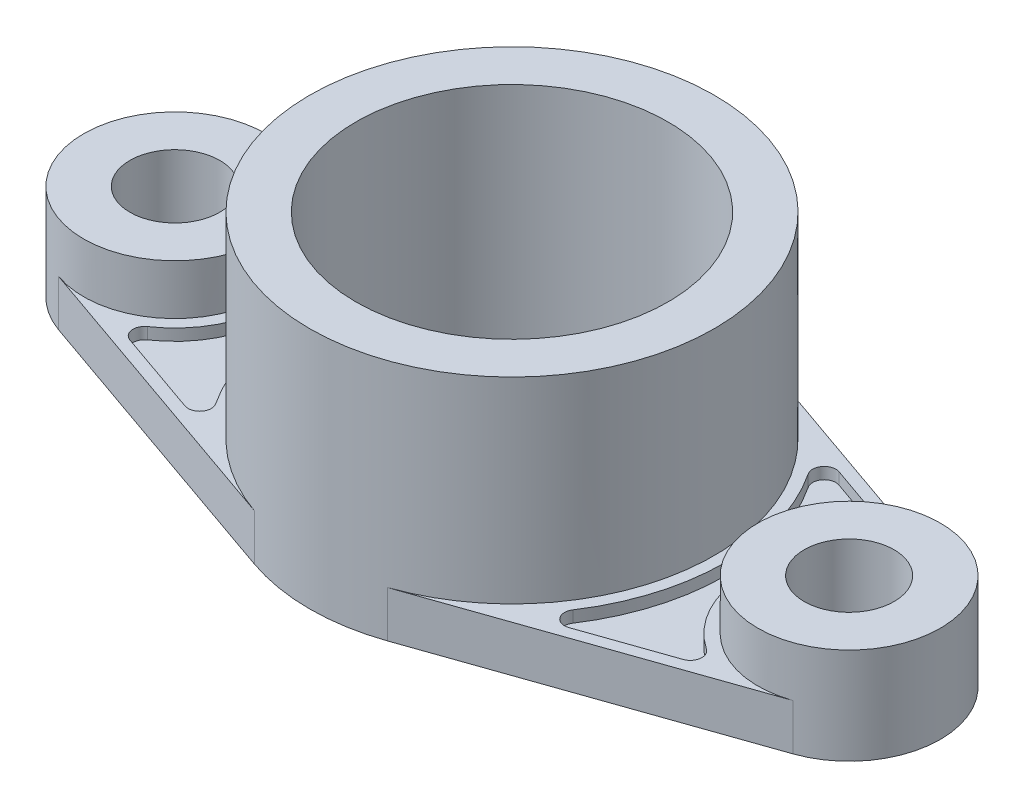
ISO-10303-21;
HEADER;
FILE_DESCRIPTION(('STEP AP214'),'2;1');
FILE_NAME('part.step','',(''),(''),'','','');
FILE_SCHEMA(('AUTOMOTIVE_DESIGN { 1 0 10303 214 1 1 1 1 }'));
ENDSEC;
DATA;
#1=APPLICATION_CONTEXT('core data for automotive mechanical design processes');
#2=APPLICATION_PROTOCOL_DEFINITION('international standard','automotive_design',2000,#1);
#3=PRODUCT_CONTEXT('',#1,'mechanical');
#4=PRODUCT('Part','Part','',(#3));
#5=PRODUCT_RELATED_PRODUCT_CATEGORY('part','',(#4));
#6=PRODUCT_DEFINITION_FORMATION('','',#4);
#7=PRODUCT_DEFINITION_CONTEXT('part definition',#1,'design');
#8=PRODUCT_DEFINITION('design','',#6,#7);
#9=PRODUCT_DEFINITION_SHAPE('','',#8);
#10=(LENGTH_UNIT() NAMED_UNIT(*) SI_UNIT(.MILLI.,.METRE.));
#11=(NAMED_UNIT(*) PLANE_ANGLE_UNIT() SI_UNIT($,.RADIAN.));
#12=(NAMED_UNIT(*) SI_UNIT($,.STERADIAN.) SOLID_ANGLE_UNIT());
#13=UNCERTAINTY_MEASURE_WITH_UNIT(LENGTH_MEASURE(1.E-05),#10,'distance_accuracy_value','');
#14=(GEOMETRIC_REPRESENTATION_CONTEXT(3) GLOBAL_UNCERTAINTY_ASSIGNED_CONTEXT((#13)) GLOBAL_UNIT_ASSIGNED_CONTEXT((#10,
#11,#12)) REPRESENTATION_CONTEXT('',''));
#15=CARTESIAN_POINT('',(0.,0.,0.));
#16=DIRECTION('',(0.,0.,1.));
#17=DIRECTION('',(1.,0.,0.));
#18=AXIS2_PLACEMENT_3D('',#15,#16,#17);
#19=CARTESIAN_POINT('',(0.,63.,0.));
#20=DIRECTION('',(0.,-1.,0.));
#21=DIRECTION('',(0.,0.,-1.));
#22=AXIS2_PLACEMENT_3D('',#19,#20,#21);
#23=CYLINDRICAL_SURFACE('',#22,52.5);
#24=CARTESIAN_POINT('',(0.,63.,0.));
#25=DIRECTION('',(0.,1.,0.));
#26=DIRECTION('',(0.,0.,1.));
#27=AXIS2_PLACEMENT_3D('',#24,#25,#26);
#28=CIRCLE('',#27,52.5);
#29=CARTESIAN_POINT('',(0.,63.,52.5));
#30=VERTEX_POINT('',#29);
#31=EDGE_CURVE('E11',#30,#30,#28,.T.);
#32=ORIENTED_EDGE('',*,*,#31,.F.);
#33=EDGE_LOOP('',(#32));
#34=FACE_BOUND('',#33,.T.);
#35=DIRECTION('',(0.,-1.,0.));
#36=VECTOR('',#35,1.);
#37=CARTESIAN_POINT('',(17.301,12.,49.56738241021));
#38=LINE('',#37,#36);
#39=CARTESIAN_POINT('',(17.301,12.,49.56738241021));
#40=VERTEX_POINT('',#39);
#41=CARTESIAN_POINT('',(17.301,0.,49.56738241021));
#42=VERTEX_POINT('',#41);
#43=EDGE_CURVE('E430',#40,#42,#38,.T.);
#44=ORIENTED_EDGE('',*,*,#43,.F.);
#45=CARTESIAN_POINT('',(0.,12.,0.));
#46=DIRECTION('',(0.,1.,0.));
#47=DIRECTION('',(0.,0.,1.));
#48=AXIS2_PLACEMENT_3D('',#45,#46,#47);
#49=CIRCLE('',#48,52.5);
#50=CARTESIAN_POINT('',(17.301,12.,-49.56738241021));
#51=VERTEX_POINT('',#50);
#52=EDGE_CURVE('E398',#40,#51,#49,.T.);
#53=ORIENTED_EDGE('',*,*,#52,.T.);
#54=DIRECTION('',(0.,-1.,0.));
#55=VECTOR('',#54,1.);
#56=CARTESIAN_POINT('',(17.301,12.,-49.56738241021));
#57=LINE('',#56,#55);
#58=CARTESIAN_POINT('',(17.301,0.,-49.56738241021));
#59=VERTEX_POINT('',#58);
#60=EDGE_CURVE('E414',#51,#59,#57,.T.);
#61=ORIENTED_EDGE('',*,*,#60,.T.);
#62=CARTESIAN_POINT('',(0.,0.,0.));
#63=DIRECTION('',(0.,1.,0.));
#64=DIRECTION('',(0.,0.,1.));
#65=AXIS2_PLACEMENT_3D('',#62,#63,#64);
#66=CIRCLE('',#65,52.5);
#67=CARTESIAN_POINT('',(-17.301,0.,-49.56738241021));
#68=VERTEX_POINT('',#67);
#69=EDGE_CURVE('E492',#59,#68,#66,.T.);
#70=ORIENTED_EDGE('',*,*,#69,.T.);
#71=DIRECTION('',(0.,-1.,0.));
#72=VECTOR('',#71,1.);
#73=CARTESIAN_POINT('',(-17.301,12.,-49.56738241021));
#74=LINE('',#73,#72);
#75=CARTESIAN_POINT('',(-17.301,12.,-49.56738241021));
#76=VERTEX_POINT('',#75);
#77=EDGE_CURVE('E483',#76,#68,#74,.T.);
#78=ORIENTED_EDGE('',*,*,#77,.F.);
#79=CARTESIAN_POINT('',(0.,12.,0.));
#80=DIRECTION('',(0.,1.,0.));
#81=DIRECTION('',(0.,0.,1.));
#82=AXIS2_PLACEMENT_3D('',#79,#80,#81);
#83=CIRCLE('',#82,52.5);
#84=CARTESIAN_POINT('',(-17.301,12.,49.56738241021));
#85=VERTEX_POINT('',#84);
#86=EDGE_CURVE('E451',#76,#85,#83,.T.);
#87=ORIENTED_EDGE('',*,*,#86,.T.);
#88=DIRECTION('',(0.,-1.,0.));
#89=VECTOR('',#88,1.);
#90=CARTESIAN_POINT('',(-17.301,12.,49.56738241021));
#91=LINE('',#90,#89);
#92=CARTESIAN_POINT('',(-17.301,0.,49.56738241021));
#93=VERTEX_POINT('',#92);
#94=EDGE_CURVE('E467',#85,#93,#91,.T.);
#95=ORIENTED_EDGE('',*,*,#94,.T.);
#96=EDGE_CURVE('E48',#93,#42,#66,.T.);
#97=ORIENTED_EDGE('',*,*,#96,.T.);
#98=EDGE_LOOP('',(#44,#53,#61,#70,#78,#87,#95,#97));
#99=FACE_BOUND('',#98,.T.);
#100=ADVANCED_FACE('F45',(#34,#99),#23,.T.);
#101=CARTESIAN_POINT('',(0.,63.,0.));
#102=DIRECTION('',(0.,1.,0.));
#103=DIRECTION('',(0.,0.,1.));
#104=AXIS2_PLACEMENT_3D('',#101,#102,#103);
#105=PLANE('',#104);
#106=ORIENTED_EDGE('',*,*,#31,.T.);
#107=EDGE_LOOP('',(#106));
#108=FACE_BOUND('',#107,.T.);
#109=CARTESIAN_POINT('',(0.,63.,0.));
#110=DIRECTION('',(0.,1.,0.));
#111=DIRECTION('',(0.,0.,1.));
#112=AXIS2_PLACEMENT_3D('',#109,#110,#111);
#113=CIRCLE('',#112,40.5);
#114=CARTESIAN_POINT('',(0.,63.,40.5));
#115=VERTEX_POINT('',#114);
#116=EDGE_CURVE('E488',#115,#115,#113,.T.);
#117=ORIENTED_EDGE('',*,*,#116,.F.);
#118=EDGE_LOOP('',(#117));
#119=FACE_BOUND('',#118,.T.);
#120=ADVANCED_FACE('F512',(#108,#119),#105,.T.);
#121=CARTESIAN_POINT('',(0.,0.,0.));
#122=DIRECTION('',(0.,1.,0.));
#123=DIRECTION('',(0.,0.,1.));
#124=AXIS2_PLACEMENT_3D('',#121,#122,#123);
#125=PLANE('',#124);
#126=ORIENTED_EDGE('',*,*,#96,.F.);
#127=DIRECTION('',(0.944140617337334,0.,0.329542857142857));
#128=VECTOR('',#127,1.);
#129=CARTESIAN_POINT('',(-17.301,0.,49.56738241021));
#130=LINE('',#129,#128);
#131=CARTESIAN_POINT('',(-95.2986317142857,0.,22.343087709288));
#132=VERTEX_POINT('',#131);
#133=EDGE_CURVE('E455',#132,#93,#130,.T.);
#134=ORIENTED_EDGE('',*,*,#133,.F.);
#135=CARTESIAN_POINT('',(-87.5,0.,0.));
#136=DIRECTION('',(0.,1.,0.));
#137=DIRECTION('',(0.,0.,1.));
#138=AXIS2_PLACEMENT_3D('',#135,#136,#137);
#139=CIRCLE('',#138,23.665);
#140=CARTESIAN_POINT('',(-95.2986317142857,0.,-22.343087709288));
#141=VERTEX_POINT('',#140);
#142=EDGE_CURVE('E439',#141,#132,#139,.T.);
#143=ORIENTED_EDGE('',*,*,#142,.F.);
#144=DIRECTION('',(-0.944140617337334,0.,0.329542857142857));
#145=VECTOR('',#144,1.);
#146=CARTESIAN_POINT('',(-17.301,0.,-49.56738241021));
#147=LINE('',#146,#145);
#148=EDGE_CURVE('E447',#68,#141,#147,.T.);
#149=ORIENTED_EDGE('',*,*,#148,.F.);
#150=ORIENTED_EDGE('',*,*,#69,.F.);
#151=DIRECTION('',(0.944140617337334,0.,0.329542857142857));
#152=VECTOR('',#151,1.);
#153=CARTESIAN_POINT('',(17.301,0.,-49.56738241021));
#154=LINE('',#153,#152);
#155=CARTESIAN_POINT('',(95.2986317142857,0.,-22.343087709288));
#156=VERTEX_POINT('',#155);
#157=EDGE_CURVE('E402',#59,#156,#154,.T.);
#158=ORIENTED_EDGE('',*,*,#157,.T.);
#159=CARTESIAN_POINT('',(87.5,0.,0.));
#160=DIRECTION('',(0.,1.,0.));
#161=DIRECTION('',(0.,0.,1.));
#162=AXIS2_PLACEMENT_3D('',#159,#160,#161);
#163=CIRCLE('',#162,23.665);
#164=CARTESIAN_POINT('',(95.2986317142857,0.,22.343087709288));
#165=VERTEX_POINT('',#164);
#166=EDGE_CURVE('E382',#165,#156,#163,.T.);
#167=ORIENTED_EDGE('',*,*,#166,.F.);
#168=DIRECTION('',(0.944140617337334,0.,-0.329542857142857));
#169=VECTOR('',#168,1.);
#170=CARTESIAN_POINT('',(17.301,0.,49.56738241021));
#171=LINE('',#170,#169);
#172=EDGE_CURVE('E394',#42,#165,#171,.T.);
#173=ORIENTED_EDGE('',*,*,#172,.F.);
#174=EDGE_LOOP('',(#126,#134,#143,#149,#150,#158,#167,#173));
#175=FACE_BOUND('',#174,.T.);
#176=CARTESIAN_POINT('',(0.,0.,0.));
#177=DIRECTION('',(0.,1.,0.));
#178=DIRECTION('',(0.,0.,1.));
#179=AXIS2_PLACEMENT_3D('',#176,#177,#178);
#180=CIRCLE('',#179,40.5);
#181=CARTESIAN_POINT('',(0.,0.,40.5));
#182=VERTEX_POINT('',#181);
#183=EDGE_CURVE('E487',#182,#182,#180,.T.);
#184=ORIENTED_EDGE('',*,*,#183,.T.);
#185=EDGE_LOOP('',(#184));
#186=FACE_BOUND('',#185,.T.);
#187=CARTESIAN_POINT('',(-87.5,0.,0.));
#188=DIRECTION('',(0.,1.,0.));
#189=DIRECTION('',(0.,0.,1.));
#190=AXIS2_PLACEMENT_3D('',#187,#188,#189);
#191=CIRCLE('',#190,11.665);
#192=CARTESIAN_POINT('',(-87.5,0.,11.665));
#193=VERTEX_POINT('',#192);
#194=EDGE_CURVE('E434',#193,#193,#191,.T.);
#195=ORIENTED_EDGE('',*,*,#194,.T.);
#196=EDGE_LOOP('',(#195));
#197=FACE_BOUND('',#196,.T.);
#198=CARTESIAN_POINT('',(87.5,0.,0.));
#199=DIRECTION('',(0.,1.,0.));
#200=DIRECTION('',(0.,0.,1.));
#201=AXIS2_PLACEMENT_3D('',#198,#199,#200);
#202=CIRCLE('',#201,11.665);
#203=CARTESIAN_POINT('',(87.5,0.,11.665));
#204=VERTEX_POINT('',#203);
#205=EDGE_CURVE('E390',#204,#204,#202,.T.);
#206=ORIENTED_EDGE('',*,*,#205,.T.);
#207=EDGE_LOOP('',(#206));
#208=FACE_BOUND('',#207,.T.);
#209=ADVANCED_FACE('F497',(#175,#186,#197,#208),#125,.F.);
#210=CARTESIAN_POINT('',(0.,63.,0.));
#211=DIRECTION('',(0.,-1.,0.));
#212=DIRECTION('',(0.,0.,-1.));
#213=AXIS2_PLACEMENT_3D('',#210,#211,#212);
#214=CYLINDRICAL_SURFACE('',#213,40.5);
#215=ORIENTED_EDGE('',*,*,#116,.T.);
#216=EDGE_LOOP('',(#215));
#217=FACE_BOUND('',#216,.T.);
#218=ORIENTED_EDGE('',*,*,#183,.F.);
#219=EDGE_LOOP('',(#218));
#220=FACE_BOUND('',#219,.T.);
#221=ADVANCED_FACE('F500',(#217,#220),#214,.F.);
#222=CARTESIAN_POINT('',(-17.301,12.,-49.56738241021));
#223=DIRECTION('',(0.329542857142857,0.,0.944140617337334));
#224=DIRECTION('',(0.944140617337334,0.,-0.329542857142857));
#225=AXIS2_PLACEMENT_3D('',#222,#223,#224);
#226=PLANE('',#225);
#227=ORIENTED_EDGE('',*,*,#148,.T.);
#228=DIRECTION('',(0.,-1.,0.));
#229=VECTOR('',#228,1.);
#230=CARTESIAN_POINT('',(-95.2986317142857,12.,-22.343087709288));
#231=LINE('',#230,#229);
#232=CARTESIAN_POINT('',(-95.2986317142857,12.,-22.343087709288));
#233=VERTEX_POINT('',#232);
#234=EDGE_CURVE('E479',#233,#141,#231,.T.);
#235=ORIENTED_EDGE('',*,*,#234,.F.);
#236=DIRECTION('',(-0.944140617337334,0.,0.329542857142857));
#237=VECTOR('',#236,1.);
#238=CARTESIAN_POINT('',(-17.301,12.,-49.56738241021));
#239=LINE('',#238,#237);
#240=EDGE_CURVE('E454',#76,#233,#239,.T.);
#241=ORIENTED_EDGE('',*,*,#240,.F.);
#242=ORIENTED_EDGE('',*,*,#77,.T.);
#243=EDGE_LOOP('',(#227,#235,#241,#242));
#244=FACE_BOUND('',#243,.T.);
#245=ADVANCED_FACE('F502',(#244),#226,.F.);
#246=CARTESIAN_POINT('',(-17.301,12.,49.56738241021));
#247=DIRECTION('',(0.329542857142857,0.,-0.944140617337334));
#248=DIRECTION('',(-0.944140617337334,0.,-0.329542857142857));
#249=AXIS2_PLACEMENT_3D('',#246,#247,#248);
#250=PLANE('',#249);
#251=ORIENTED_EDGE('',*,*,#133,.T.);
#252=ORIENTED_EDGE('',*,*,#94,.F.);
#253=DIRECTION('',(0.944140617337334,0.,0.329542857142857));
#254=VECTOR('',#253,1.);
#255=CARTESIAN_POINT('',(-17.301,12.,49.56738241021));
#256=LINE('',#255,#254);
#257=CARTESIAN_POINT('',(-95.2986317142857,12.,22.343087709288));
#258=VERTEX_POINT('',#257);
#259=EDGE_CURVE('E463',#258,#85,#256,.T.);
#260=ORIENTED_EDGE('',*,*,#259,.F.);
#261=DIRECTION('',(0.,-1.,0.));
#262=VECTOR('',#261,1.);
#263=CARTESIAN_POINT('',(-95.2986317142857,12.,22.343087709288));
#264=LINE('',#263,#262);
#265=EDGE_CURVE('E476',#258,#132,#264,.T.);
#266=ORIENTED_EDGE('',*,*,#265,.T.);
#267=EDGE_LOOP('',(#251,#252,#260,#266));
#268=FACE_BOUND('',#267,.T.);
#269=ADVANCED_FACE('F509',(#268),#250,.F.);
#270=CARTESIAN_POINT('',(0.,12.,0.));
#271=DIRECTION('',(0.,1.,0.));
#272=DIRECTION('',(0.,0.,1.));
#273=AXIS2_PLACEMENT_3D('',#270,#271,#272);
#274=PLANE('',#273);
#275=CARTESIAN_POINT('',(-48.8374101689385,12.,-32.2049276973396));
#276=DIRECTION('',(0.,1.,0.));
#277=DIRECTION('',(0.,0.,1.));
#278=AXIS2_PLACEMENT_3D('',#275,#276,#277);
#279=CIRCLE('',#278,3.00000000000001);
#280=CARTESIAN_POINT('',(-46.3329275961723,12.,-30.5533929436299));
#281=VERTEX_POINT('',#280);
#282=CARTESIAN_POINT('',(-49.826038740367,12.,-35.0373495493516));
#283=VERTEX_POINT('',#282);
#284=EDGE_CURVE('E60',#281,#283,#279,.T.);
#285=ORIENTED_EDGE('',*,*,#284,.F.);
#286=CARTESIAN_POINT('',(0.,12.,0.));
#287=DIRECTION('',(0.,1.,0.));
#288=DIRECTION('',(0.,0.,1.));
#289=AXIS2_PLACEMENT_3D('',#286,#287,#288);
#290=CIRCLE('',#289,55.5);
#291=CARTESIAN_POINT('',(-46.3329275961724,12.,30.5533929436298));
#292=VERTEX_POINT('',#291);
#293=EDGE_CURVE('E230',#281,#292,#290,.T.);
#294=ORIENTED_EDGE('',*,*,#293,.T.);
#295=CARTESIAN_POINT('',(-48.8374101689384,12.,32.2049276973396));
#296=DIRECTION('',(0.,1.,0.));
#297=DIRECTION('',(0.,0.,1.));
#298=AXIS2_PLACEMENT_3D('',#295,#296,#297);
#299=CIRCLE('',#298,3.);
#300=CARTESIAN_POINT('',(-49.826038740367,12.,35.0373495493516));
#301=VERTEX_POINT('',#300);
#302=EDGE_CURVE('E234',#301,#292,#299,.T.);
#303=ORIENTED_EDGE('',*,*,#302,.F.);
#304=DIRECTION('',(0.944140617337334,0.,0.329542857142857));
#305=VECTOR('',#304,1.);
#306=CARTESIAN_POINT('',(-71.8093276206941,12.,27.3643020244494));
#307=LINE('',#306,#305);
#308=CARTESIAN_POINT('',(-71.8093276206941,12.,27.3643020244494));
#309=VERTEX_POINT('',#308);
#310=EDGE_CURVE('E272',#309,#301,#307,.T.);
#311=ORIENTED_EDGE('',*,*,#310,.F.);
#312=CARTESIAN_POINT('',(-70.8206990492656,12.,24.5318801724374));
#313=DIRECTION('',(0.,1.,0.));
#314=DIRECTION('',(0.,0.,1.));
#315=AXIS2_PLACEMENT_3D('',#312,#313,#314);
#316=CIRCLE('',#315,3.);
#317=CARTESIAN_POINT('',(-72.507464694039,12.,22.0509888689716));
#318=VERTEX_POINT('',#317);
#319=EDGE_CURVE('E268',#318,#309,#316,.T.);
#320=ORIENTED_EDGE('',*,*,#319,.F.);
#321=CARTESIAN_POINT('',(-87.5,12.,0.));
#322=DIRECTION('',(0.,1.,0.));
#323=DIRECTION('',(0.,0.,1.));
#324=AXIS2_PLACEMENT_3D('',#321,#322,#323);
#325=CIRCLE('',#324,26.665);
#326=CARTESIAN_POINT('',(-72.507464694039,12.,-22.0509888689717));
#327=VERTEX_POINT('',#326);
#328=EDGE_CURVE('E264',#318,#327,#325,.T.);
#329=ORIENTED_EDGE('',*,*,#328,.T.);
#330=CARTESIAN_POINT('',(-70.8206990492656,12.,-24.5318801724374));
#331=DIRECTION('',(0.,-1.,0.));
#332=DIRECTION('',(0.,0.,-1.));
#333=AXIS2_PLACEMENT_3D('',#330,#331,#332);
#334=CIRCLE('',#333,3.);
#335=CARTESIAN_POINT('',(-71.8093276206941,12.,-27.3643020244494));
#336=VERTEX_POINT('',#335);
#337=EDGE_CURVE('E260',#327,#336,#334,.T.);
#338=ORIENTED_EDGE('',*,*,#337,.T.);
#339=DIRECTION('',(-0.944140617337334,0.,0.329542857142858));
#340=VECTOR('',#339,1.);
#341=CARTESIAN_POINT('',(-49.826038740367,12.,-35.0373495493516));
#342=LINE('',#341,#340);
#343=EDGE_CURVE('E257',#283,#336,#342,.T.);
#344=ORIENTED_EDGE('',*,*,#343,.F.);
#345=EDGE_LOOP('',(#285,#294,#303,#311,#320,#329,#338,#344));
#346=FACE_BOUND('',#345,.T.);
#347=ORIENTED_EDGE('',*,*,#86,.F.);
#348=ORIENTED_EDGE('',*,*,#240,.T.);
#349=CARTESIAN_POINT('',(-87.5,12.,0.));
#350=DIRECTION('',(0.,1.,0.));
#351=DIRECTION('',(0.,0.,1.));
#352=AXIS2_PLACEMENT_3D('',#349,#350,#351);
#353=CIRCLE('',#352,23.665);
#354=EDGE_CURVE('E459',#258,#233,#353,.T.);
#355=ORIENTED_EDGE('',*,*,#354,.F.);
#356=ORIENTED_EDGE('',*,*,#259,.T.);
#357=EDGE_LOOP('',(#347,#348,#355,#356));
#358=FACE_BOUND('',#357,.T.);
#359=ADVANCED_FACE('F548',(#346,#358),#274,.T.);
#360=CARTESIAN_POINT('',(-87.5,25.,0.));
#361=DIRECTION('',(0.,1.,0.));
#362=DIRECTION('',(0.,0.,1.));
#363=AXIS2_PLACEMENT_3D('',#360,#361,#362);
#364=PLANE('',#363);
#365=CARTESIAN_POINT('',(-87.5,25.,0.));
#366=DIRECTION('',(0.,1.,0.));
#367=DIRECTION('',(0.,0.,1.));
#368=AXIS2_PLACEMENT_3D('',#365,#366,#367);
#369=CIRCLE('',#368,23.665);
#370=CARTESIAN_POINT('',(-87.5,25.,23.665));
#371=VERTEX_POINT('',#370);
#372=EDGE_CURVE('E443',#371,#371,#369,.T.);
#373=ORIENTED_EDGE('',*,*,#372,.T.);
#374=EDGE_LOOP('',(#373));
#375=FACE_BOUND('',#374,.T.);
#376=CARTESIAN_POINT('',(-87.5,25.,0.));
#377=DIRECTION('',(0.,1.,0.));
#378=DIRECTION('',(0.,0.,1.));
#379=AXIS2_PLACEMENT_3D('',#376,#377,#378);
#380=CIRCLE('',#379,11.665);
#381=CARTESIAN_POINT('',(-87.5,25.,11.665));
#382=VERTEX_POINT('',#381);
#383=EDGE_CURVE('E435',#382,#382,#380,.T.);
#384=ORIENTED_EDGE('',*,*,#383,.F.);
#385=EDGE_LOOP('',(#384));
#386=FACE_BOUND('',#385,.T.);
#387=ADVANCED_FACE('F558',(#375,#386),#364,.T.);
#388=CARTESIAN_POINT('',(-87.5,25.,0.));
#389=DIRECTION('',(0.,-1.,0.));
#390=DIRECTION('',(0.,0.,-1.));
#391=AXIS2_PLACEMENT_3D('',#388,#389,#390);
#392=CYLINDRICAL_SURFACE('',#391,23.665);
#393=ORIENTED_EDGE('',*,*,#234,.T.);
#394=ORIENTED_EDGE('',*,*,#142,.T.);
#395=ORIENTED_EDGE('',*,*,#265,.F.);
#396=ORIENTED_EDGE('',*,*,#354,.T.);
#397=EDGE_LOOP('',(#393,#394,#395,#396));
#398=FACE_BOUND('',#397,.T.);
#399=ORIENTED_EDGE('',*,*,#372,.F.);
#400=EDGE_LOOP('',(#399));
#401=FACE_BOUND('',#400,.T.);
#402=ADVANCED_FACE('F554',(#398,#401),#392,.T.);
#403=CARTESIAN_POINT('',(-87.5,25.,0.));
#404=DIRECTION('',(0.,-1.,0.));
#405=DIRECTION('',(0.,0.,-1.));
#406=AXIS2_PLACEMENT_3D('',#403,#404,#405);
#407=CYLINDRICAL_SURFACE('',#406,11.665);
#408=ORIENTED_EDGE('',*,*,#383,.T.);
#409=EDGE_LOOP('',(#408));
#410=FACE_BOUND('',#409,.T.);
#411=ORIENTED_EDGE('',*,*,#194,.F.);
#412=EDGE_LOOP('',(#411));
#413=FACE_BOUND('',#412,.T.);
#414=ADVANCED_FACE('F557',(#410,#413),#407,.F.);
#415=CARTESIAN_POINT('',(17.301,12.,49.56738241021));
#416=DIRECTION('',(-0.329542857142857,0.,-0.944140617337334));
#417=DIRECTION('',(-0.944140617337334,0.,0.329542857142857));
#418=AXIS2_PLACEMENT_3D('',#415,#416,#417);
#419=PLANE('',#418);
#420=ORIENTED_EDGE('',*,*,#172,.T.);
#421=DIRECTION('',(0.,-1.,0.));
#422=VECTOR('',#421,1.);
#423=CARTESIAN_POINT('',(95.2986317142857,12.,22.343087709288));
#424=LINE('',#423,#422);
#425=CARTESIAN_POINT('',(95.2986317142857,12.,22.343087709288));
#426=VERTEX_POINT('',#425);
#427=EDGE_CURVE('E426',#426,#165,#424,.T.);
#428=ORIENTED_EDGE('',*,*,#427,.F.);
#429=DIRECTION('',(0.944140617337334,0.,-0.329542857142857));
#430=VECTOR('',#429,1.);
#431=CARTESIAN_POINT('',(17.301,12.,49.56738241021));
#432=LINE('',#431,#430);
#433=EDGE_CURVE('E401',#40,#426,#432,.T.);
#434=ORIENTED_EDGE('',*,*,#433,.F.);
#435=ORIENTED_EDGE('',*,*,#43,.T.);
#436=EDGE_LOOP('',(#420,#428,#434,#435));
#437=FACE_BOUND('',#436,.T.);
#438=ADVANCED_FACE('F528',(#437),#419,.F.);
#439=CARTESIAN_POINT('',(17.301,12.,-49.56738241021));
#440=DIRECTION('',(0.329542857142857,0.,-0.944140617337334));
#441=DIRECTION('',(-0.944140617337334,0.,-0.329542857142857));
#442=AXIS2_PLACEMENT_3D('',#439,#440,#441);
#443=PLANE('',#442);
#444=ORIENTED_EDGE('',*,*,#157,.F.);
#445=ORIENTED_EDGE('',*,*,#60,.F.);
#446=DIRECTION('',(0.944140617337334,0.,0.329542857142857));
#447=VECTOR('',#446,1.);
#448=CARTESIAN_POINT('',(17.301,12.,-49.56738241021));
#449=LINE('',#448,#447);
#450=CARTESIAN_POINT('',(95.2986317142857,12.,-22.343087709288));
#451=VERTEX_POINT('',#450);
#452=EDGE_CURVE('E410',#51,#451,#449,.T.);
#453=ORIENTED_EDGE('',*,*,#452,.T.);
#454=DIRECTION('',(0.,-1.,0.));
#455=VECTOR('',#454,1.);
#456=CARTESIAN_POINT('',(95.2986317142857,12.,-22.343087709288));
#457=LINE('',#456,#455);
#458=EDGE_CURVE('E423',#451,#156,#457,.T.);
#459=ORIENTED_EDGE('',*,*,#458,.T.);
#460=EDGE_LOOP('',(#444,#445,#453,#459));
#461=FACE_BOUND('',#460,.T.);
#462=ADVANCED_FACE('F535',(#461),#443,.T.);
#463=CARTESIAN_POINT('',(0.,12.,0.));
#464=DIRECTION('',(0.,1.,0.));
#465=DIRECTION('',(0.,0.,1.));
#466=AXIS2_PLACEMENT_3D('',#463,#464,#465);
#467=PLANE('',#466);
#468=CARTESIAN_POINT('',(0.,12.,0.));
#469=DIRECTION('',(0.,-1.,0.));
#470=DIRECTION('',(0.,0.,-1.));
#471=AXIS2_PLACEMENT_3D('',#468,#469,#470);
#472=CIRCLE('',#471,55.5);
#473=CARTESIAN_POINT('',(46.3329275961724,12.,-30.5533929436299));
#474=VERTEX_POINT('',#473);
#475=CARTESIAN_POINT('',(46.3329275961724,12.,30.5533929436298));
#476=VERTEX_POINT('',#475);
#477=EDGE_CURVE('E325',#474,#476,#472,.T.);
#478=ORIENTED_EDGE('',*,*,#477,.F.);
#479=CARTESIAN_POINT('',(48.8374101689385,12.,-32.2049276973396));
#480=DIRECTION('',(0.,-1.,0.));
#481=DIRECTION('',(0.,0.,-1.));
#482=AXIS2_PLACEMENT_3D('',#479,#480,#481);
#483=CIRCLE('',#482,3.00000000000001);
#484=CARTESIAN_POINT('',(49.826038740367,12.,-35.0373495493516));
#485=VERTEX_POINT('',#484);
#486=EDGE_CURVE('E68',#474,#485,#483,.T.);
#487=ORIENTED_EDGE('',*,*,#486,.T.);
#488=DIRECTION('',(0.944140617337334,0.,0.329542857142858));
#489=VECTOR('',#488,1.);
#490=CARTESIAN_POINT('',(49.826038740367,12.,-35.0373495493516));
#491=LINE('',#490,#489);
#492=CARTESIAN_POINT('',(71.8093276206941,12.,-27.3643020244494));
#493=VERTEX_POINT('',#492);
#494=EDGE_CURVE('E350',#485,#493,#491,.T.);
#495=ORIENTED_EDGE('',*,*,#494,.T.);
#496=CARTESIAN_POINT('',(70.8206990492656,12.,-24.5318801724374));
#497=DIRECTION('',(0.,1.,0.));
#498=DIRECTION('',(0.,0.,1.));
#499=AXIS2_PLACEMENT_3D('',#496,#497,#498);
#500=CIRCLE('',#499,3.);
#501=CARTESIAN_POINT('',(72.507464694039,12.,-22.0509888689716));
#502=VERTEX_POINT('',#501);
#503=EDGE_CURVE('E346',#502,#493,#500,.T.);
#504=ORIENTED_EDGE('',*,*,#503,.F.);
#505=CARTESIAN_POINT('',(87.5,12.,0.));
#506=DIRECTION('',(0.,-1.,0.));
#507=DIRECTION('',(0.,0.,-1.));
#508=AXIS2_PLACEMENT_3D('',#505,#506,#507);
#509=CIRCLE('',#508,26.665);
#510=CARTESIAN_POINT('',(72.507464694039,12.,22.0509888689716));
#511=VERTEX_POINT('',#510);
#512=EDGE_CURVE('E342',#511,#502,#509,.T.);
#513=ORIENTED_EDGE('',*,*,#512,.F.);
#514=CARTESIAN_POINT('',(70.8206990492656,12.,24.5318801724374));
#515=DIRECTION('',(0.,-1.,0.));
#516=DIRECTION('',(0.,0.,-1.));
#517=AXIS2_PLACEMENT_3D('',#514,#515,#516);
#518=CIRCLE('',#517,3.);
#519=CARTESIAN_POINT('',(71.8093276206941,12.,27.3643020244494));
#520=VERTEX_POINT('',#519);
#521=EDGE_CURVE('E338',#511,#520,#518,.T.);
#522=ORIENTED_EDGE('',*,*,#521,.T.);
#523=DIRECTION('',(-0.944140617337334,0.,0.329542857142857));
#524=VECTOR('',#523,1.);
#525=CARTESIAN_POINT('',(71.8093276206941,12.,27.3643020244494));
#526=LINE('',#525,#524);
#527=CARTESIAN_POINT('',(49.826038740367,12.,35.0373495493516));
#528=VERTEX_POINT('',#527);
#529=EDGE_CURVE('E334',#520,#528,#526,.T.);
#530=ORIENTED_EDGE('',*,*,#529,.T.);
#531=CARTESIAN_POINT('',(48.8374101689384,12.,32.2049276973396));
#532=DIRECTION('',(0.,-1.,0.));
#533=DIRECTION('',(0.,0.,-1.));
#534=AXIS2_PLACEMENT_3D('',#531,#532,#533);
#535=CIRCLE('',#534,3.);
#536=EDGE_CURVE('E329',#528,#476,#535,.T.);
#537=ORIENTED_EDGE('',*,*,#536,.T.);
#538=EDGE_LOOP('',(#478,#487,#495,#504,#513,#522,#530,#537));
#539=FACE_BOUND('',#538,.T.);
#540=ORIENTED_EDGE('',*,*,#52,.F.);
#541=ORIENTED_EDGE('',*,*,#433,.T.);
#542=CARTESIAN_POINT('',(87.5,12.,0.));
#543=DIRECTION('',(0.,1.,0.));
#544=DIRECTION('',(0.,0.,1.));
#545=AXIS2_PLACEMENT_3D('',#542,#543,#544);
#546=CIRCLE('',#545,23.665);
#547=EDGE_CURVE('E406',#451,#426,#546,.T.);
#548=ORIENTED_EDGE('',*,*,#547,.F.);
#549=ORIENTED_EDGE('',*,*,#452,.F.);
#550=EDGE_LOOP('',(#540,#541,#548,#549));
#551=FACE_BOUND('',#550,.T.);
#552=ADVANCED_FACE('F531',(#539,#551),#467,.T.);
#553=CARTESIAN_POINT('',(87.5,25.,0.));
#554=DIRECTION('',(0.,1.,0.));
#555=DIRECTION('',(0.,0.,1.));
#556=AXIS2_PLACEMENT_3D('',#553,#554,#555);
#557=PLANE('',#556);
#558=CARTESIAN_POINT('',(87.5,25.,0.));
#559=DIRECTION('',(0.,1.,0.));
#560=DIRECTION('',(0.,0.,1.));
#561=AXIS2_PLACEMENT_3D('',#558,#559,#560);
#562=CIRCLE('',#561,23.665);
#563=CARTESIAN_POINT('',(87.5,25.,23.665));
#564=VERTEX_POINT('',#563);
#565=EDGE_CURVE('E282',#564,#564,#562,.T.);
#566=ORIENTED_EDGE('',*,*,#565,.T.);
#567=EDGE_LOOP('',(#566));
#568=FACE_BOUND('',#567,.T.);
#569=CARTESIAN_POINT('',(87.5,25.,0.));
#570=DIRECTION('',(0.,1.,0.));
#571=DIRECTION('',(0.,0.,1.));
#572=AXIS2_PLACEMENT_3D('',#569,#570,#571);
#573=CIRCLE('',#572,11.665);
#574=CARTESIAN_POINT('',(87.5,25.,11.665));
#575=VERTEX_POINT('',#574);
#576=EDGE_CURVE('E386',#575,#575,#573,.T.);
#577=ORIENTED_EDGE('',*,*,#576,.F.);
#578=EDGE_LOOP('',(#577));
#579=FACE_BOUND('',#578,.T.);
#580=ADVANCED_FACE('F585',(#568,#579),#557,.T.);
#581=CARTESIAN_POINT('',(87.5,25.,0.));
#582=DIRECTION('',(0.,-1.,0.));
#583=DIRECTION('',(0.,0.,-1.));
#584=AXIS2_PLACEMENT_3D('',#581,#582,#583);
#585=CYLINDRICAL_SURFACE('',#584,23.665);
#586=ORIENTED_EDGE('',*,*,#427,.T.);
#587=ORIENTED_EDGE('',*,*,#166,.T.);
#588=ORIENTED_EDGE('',*,*,#458,.F.);
#589=ORIENTED_EDGE('',*,*,#547,.T.);
#590=EDGE_LOOP('',(#586,#587,#588,#589));
#591=FACE_BOUND('',#590,.T.);
#592=ORIENTED_EDGE('',*,*,#565,.F.);
#593=EDGE_LOOP('',(#592));
#594=FACE_BOUND('',#593,.T.);
#595=ADVANCED_FACE('F537',(#591,#594),#585,.T.);
#596=CARTESIAN_POINT('',(87.5,25.,0.));
#597=DIRECTION('',(0.,-1.,0.));
#598=DIRECTION('',(0.,0.,-1.));
#599=AXIS2_PLACEMENT_3D('',#596,#597,#598);
#600=CYLINDRICAL_SURFACE('',#599,11.665);
#601=ORIENTED_EDGE('',*,*,#576,.T.);
#602=EDGE_LOOP('',(#601));
#603=FACE_BOUND('',#602,.T.);
#604=ORIENTED_EDGE('',*,*,#205,.F.);
#605=EDGE_LOOP('',(#604));
#606=FACE_BOUND('',#605,.T.);
#607=ADVANCED_FACE('F574',(#603,#606),#600,.F.);
#608=CARTESIAN_POINT('',(48.8374101689385,9.,-32.2049276973396));
#609=DIRECTION('',(0.,1.,0.));
#610=DIRECTION('',(0.,0.,1.));
#611=AXIS2_PLACEMENT_3D('',#608,#609,#610);
#612=CYLINDRICAL_SURFACE('',#611,3.00000000000001);
#613=ORIENTED_EDGE('',*,*,#486,.F.);
#614=DIRECTION('',(0.,1.,0.));
#615=VECTOR('',#614,1.);
#616=CARTESIAN_POINT('',(46.3329275961724,9.,-30.5533929436299));
#617=LINE('',#616,#615);
#618=CARTESIAN_POINT('',(46.3329275961724,9.,-30.5533929436299));
#619=VERTEX_POINT('',#618);
#620=EDGE_CURVE('E321',#619,#474,#617,.T.);
#621=ORIENTED_EDGE('',*,*,#620,.F.);
#622=CARTESIAN_POINT('',(48.8374101689385,9.,-32.2049276973396));
#623=DIRECTION('',(0.,-1.,0.));
#624=DIRECTION('',(0.,0.,-1.));
#625=AXIS2_PLACEMENT_3D('',#622,#623,#624);
#626=CIRCLE('',#625,3.00000000000001);
#627=CARTESIAN_POINT('',(49.826038740367,9.,-35.0373495493516));
#628=VERTEX_POINT('',#627);
#629=EDGE_CURVE('E330',#619,#628,#626,.T.);
#630=ORIENTED_EDGE('',*,*,#629,.T.);
#631=DIRECTION('',(0.,1.,0.));
#632=VECTOR('',#631,1.);
#633=CARTESIAN_POINT('',(49.826038740367,9.,-35.0373495493516));
#634=LINE('',#633,#632);
#635=EDGE_CURVE('E300',#628,#485,#634,.T.);
#636=ORIENTED_EDGE('',*,*,#635,.T.);
#637=EDGE_LOOP('',(#613,#621,#630,#636));
#638=FACE_BOUND('',#637,.T.);
#639=ADVANCED_FACE('F576',(#638),#612,.F.);
#640=CARTESIAN_POINT('',(49.826038740367,9.,-35.0373495493516));
#641=DIRECTION('',(-0.329542857142858,0.,0.944140617337334));
#642=DIRECTION('',(0.944140617337334,0.,0.329542857142858));
#643=AXIS2_PLACEMENT_3D('',#640,#641,#642);
#644=PLANE('',#643);
#645=ORIENTED_EDGE('',*,*,#494,.F.);
#646=ORIENTED_EDGE('',*,*,#635,.F.);
#647=DIRECTION('',(0.944140617337334,0.,0.329542857142858));
#648=VECTOR('',#647,1.);
#649=CARTESIAN_POINT('',(49.826038740367,9.,-35.0373495493516));
#650=LINE('',#649,#648);
#651=CARTESIAN_POINT('',(71.8093276206941,9.,-27.3643020244494));
#652=VERTEX_POINT('',#651);
#653=EDGE_CURVE('E376',#628,#652,#650,.T.);
#654=ORIENTED_EDGE('',*,*,#653,.T.);
#655=DIRECTION('',(0.,1.,0.));
#656=VECTOR('',#655,1.);
#657=CARTESIAN_POINT('',(71.8093276206941,9.,-27.3643020244494));
#658=LINE('',#657,#656);
#659=EDGE_CURVE('E303',#652,#493,#658,.T.);
#660=ORIENTED_EDGE('',*,*,#659,.T.);
#661=EDGE_LOOP('',(#645,#646,#654,#660));
#662=FACE_BOUND('',#661,.T.);
#663=ADVANCED_FACE('F583',(#662),#644,.T.);
#664=CARTESIAN_POINT('',(70.8206990492656,9.,-24.5318801724374));
#665=DIRECTION('',(0.,1.,0.));
#666=DIRECTION('',(0.,0.,1.));
#667=AXIS2_PLACEMENT_3D('',#664,#665,#666);
#668=CYLINDRICAL_SURFACE('',#667,3.);
#669=ORIENTED_EDGE('',*,*,#503,.T.);
#670=ORIENTED_EDGE('',*,*,#659,.F.);
#671=CARTESIAN_POINT('',(70.8206990492656,9.,-24.5318801724374));
#672=DIRECTION('',(0.,1.,0.));
#673=DIRECTION('',(0.,0.,1.));
#674=AXIS2_PLACEMENT_3D('',#671,#672,#673);
#675=CIRCLE('',#674,3.);
#676=CARTESIAN_POINT('',(72.507464694039,9.,-22.0509888689716));
#677=VERTEX_POINT('',#676);
#678=EDGE_CURVE('E372',#677,#652,#675,.T.);
#679=ORIENTED_EDGE('',*,*,#678,.F.);
#680=DIRECTION('',(0.,1.,0.));
#681=VECTOR('',#680,1.);
#682=CARTESIAN_POINT('',(72.507464694039,9.,-22.0509888689716));
#683=LINE('',#682,#681);
#684=EDGE_CURVE('E306',#677,#502,#683,.T.);
#685=ORIENTED_EDGE('',*,*,#684,.T.);
#686=EDGE_LOOP('',(#669,#670,#679,#685));
#687=FACE_BOUND('',#686,.T.);
#688=ADVANCED_FACE('F690',(#687),#668,.F.);
#689=CARTESIAN_POINT('',(87.5,9.,0.));
#690=DIRECTION('',(0.,1.,0.));
#691=DIRECTION('',(0.,0.,1.));
#692=AXIS2_PLACEMENT_3D('',#689,#690,#691);
#693=CYLINDRICAL_SURFACE('',#692,26.665);
#694=ORIENTED_EDGE('',*,*,#512,.T.);
#695=ORIENTED_EDGE('',*,*,#684,.F.);
#696=CARTESIAN_POINT('',(87.5,9.,0.));
#697=DIRECTION('',(0.,-1.,0.));
#698=DIRECTION('',(0.,0.,-1.));
#699=AXIS2_PLACEMENT_3D('',#696,#697,#698);
#700=CIRCLE('',#699,26.665);
#701=CARTESIAN_POINT('',(72.507464694039,9.,22.0509888689716));
#702=VERTEX_POINT('',#701);
#703=EDGE_CURVE('E368',#702,#677,#700,.T.);
#704=ORIENTED_EDGE('',*,*,#703,.F.);
#705=DIRECTION('',(0.,1.,0.));
#706=VECTOR('',#705,1.);
#707=CARTESIAN_POINT('',(72.507464694039,9.,22.0509888689716));
#708=LINE('',#707,#706);
#709=EDGE_CURVE('E309',#702,#511,#708,.T.);
#710=ORIENTED_EDGE('',*,*,#709,.T.);
#711=EDGE_LOOP('',(#694,#695,#704,#710));
#712=FACE_BOUND('',#711,.T.);
#713=ADVANCED_FACE('F700',(#712),#693,.T.);
#714=CARTESIAN_POINT('',(70.8206990492656,9.,24.5318801724374));
#715=DIRECTION('',(0.,1.,0.));
#716=DIRECTION('',(0.,0.,1.));
#717=AXIS2_PLACEMENT_3D('',#714,#715,#716);
#718=CYLINDRICAL_SURFACE('',#717,3.);
#719=ORIENTED_EDGE('',*,*,#521,.F.);
#720=ORIENTED_EDGE('',*,*,#709,.F.);
#721=CARTESIAN_POINT('',(70.8206990492656,9.,24.5318801724374));
#722=DIRECTION('',(0.,-1.,0.));
#723=DIRECTION('',(0.,0.,-1.));
#724=AXIS2_PLACEMENT_3D('',#721,#722,#723);
#725=CIRCLE('',#724,3.);
#726=CARTESIAN_POINT('',(71.8093276206941,9.,27.3643020244494));
#727=VERTEX_POINT('',#726);
#728=EDGE_CURVE('E365',#702,#727,#725,.T.);
#729=ORIENTED_EDGE('',*,*,#728,.T.);
#730=DIRECTION('',(0.,1.,0.));
#731=VECTOR('',#730,1.);
#732=CARTESIAN_POINT('',(71.8093276206941,9.,27.3643020244494));
#733=LINE('',#732,#731);
#734=EDGE_CURVE('E312',#727,#520,#733,.T.);
#735=ORIENTED_EDGE('',*,*,#734,.T.);
#736=EDGE_LOOP('',(#719,#720,#729,#735));
#737=FACE_BOUND('',#736,.T.);
#738=ADVANCED_FACE('F710',(#737),#718,.F.);
#739=CARTESIAN_POINT('',(71.8093276206941,9.,27.3643020244494));
#740=DIRECTION('',(-0.329542857142857,0.,-0.944140617337334));
#741=DIRECTION('',(-0.944140617337334,0.,0.329542857142857));
#742=AXIS2_PLACEMENT_3D('',#739,#740,#741);
#743=PLANE('',#742);
#744=ORIENTED_EDGE('',*,*,#529,.F.);
#745=ORIENTED_EDGE('',*,*,#734,.F.);
#746=DIRECTION('',(-0.944140617337334,0.,0.329542857142857));
#747=VECTOR('',#746,1.);
#748=CARTESIAN_POINT('',(71.8093276206941,9.,27.3643020244494));
#749=LINE('',#748,#747);
#750=CARTESIAN_POINT('',(49.826038740367,9.,35.0373495493516));
#751=VERTEX_POINT('',#750);
#752=EDGE_CURVE('E362',#727,#751,#749,.T.);
#753=ORIENTED_EDGE('',*,*,#752,.T.);
#754=DIRECTION('',(0.,1.,0.));
#755=VECTOR('',#754,1.);
#756=CARTESIAN_POINT('',(49.826038740367,9.,35.0373495493516));
#757=LINE('',#756,#755);
#758=EDGE_CURVE('E315',#751,#528,#757,.T.);
#759=ORIENTED_EDGE('',*,*,#758,.T.);
#760=EDGE_LOOP('',(#744,#745,#753,#759));
#761=FACE_BOUND('',#760,.T.);
#762=ADVANCED_FACE('F720',(#761),#743,.T.);
#763=CARTESIAN_POINT('',(48.8374101689384,9.,32.2049276973396));
#764=DIRECTION('',(0.,1.,0.));
#765=DIRECTION('',(0.,0.,1.));
#766=AXIS2_PLACEMENT_3D('',#763,#764,#765);
#767=CYLINDRICAL_SURFACE('',#766,3.);
#768=ORIENTED_EDGE('',*,*,#536,.F.);
#769=ORIENTED_EDGE('',*,*,#758,.F.);
#770=CARTESIAN_POINT('',(48.8374101689384,9.,32.2049276973396));
#771=DIRECTION('',(0.,-1.,0.));
#772=DIRECTION('',(0.,0.,-1.));
#773=AXIS2_PLACEMENT_3D('',#770,#771,#772);
#774=CIRCLE('',#773,3.);
#775=CARTESIAN_POINT('',(46.3329275961724,9.,30.5533929436298));
#776=VERTEX_POINT('',#775);
#777=EDGE_CURVE('E359',#751,#776,#774,.T.);
#778=ORIENTED_EDGE('',*,*,#777,.T.);
#779=DIRECTION('',(0.,1.,0.));
#780=VECTOR('',#779,1.);
#781=CARTESIAN_POINT('',(46.3329275961724,9.,30.5533929436298));
#782=LINE('',#781,#780);
#783=EDGE_CURVE('E318',#776,#476,#782,.T.);
#784=ORIENTED_EDGE('',*,*,#783,.T.);
#785=EDGE_LOOP('',(#768,#769,#778,#784));
#786=FACE_BOUND('',#785,.T.);
#787=ADVANCED_FACE('F730',(#786),#767,.F.);
#788=CARTESIAN_POINT('',(0.,9.,0.));
#789=DIRECTION('',(0.,1.,0.));
#790=DIRECTION('',(0.,0.,1.));
#791=AXIS2_PLACEMENT_3D('',#788,#789,#790);
#792=CYLINDRICAL_SURFACE('',#791,55.5);
#793=ORIENTED_EDGE('',*,*,#477,.T.);
#794=ORIENTED_EDGE('',*,*,#783,.F.);
#795=CARTESIAN_POINT('',(0.,9.,0.));
#796=DIRECTION('',(0.,-1.,0.));
#797=DIRECTION('',(0.,0.,-1.));
#798=AXIS2_PLACEMENT_3D('',#795,#796,#797);
#799=CIRCLE('',#798,55.5);
#800=EDGE_CURVE('E324',#619,#776,#799,.T.);
#801=ORIENTED_EDGE('',*,*,#800,.F.);
#802=ORIENTED_EDGE('',*,*,#620,.T.);
#803=EDGE_LOOP('',(#793,#794,#801,#802));
#804=FACE_BOUND('',#803,.T.);
#805=ADVANCED_FACE('F740',(#804),#792,.T.);
#806=CARTESIAN_POINT('',(48.8374101689385,9.,-32.2049276973396));
#807=DIRECTION('',(0.,-1.,0.));
#808=DIRECTION('',(0.,0.,-1.));
#809=AXIS2_PLACEMENT_3D('',#806,#807,#808);
#810=PLANE('',#809);
#811=ORIENTED_EDGE('',*,*,#629,.F.);
#812=ORIENTED_EDGE('',*,*,#800,.T.);
#813=ORIENTED_EDGE('',*,*,#777,.F.);
#814=ORIENTED_EDGE('',*,*,#752,.F.);
#815=ORIENTED_EDGE('',*,*,#728,.F.);
#816=ORIENTED_EDGE('',*,*,#703,.T.);
#817=ORIENTED_EDGE('',*,*,#678,.T.);
#818=ORIENTED_EDGE('',*,*,#653,.F.);
#819=EDGE_LOOP('',(#811,#812,#813,#814,#815,#816,#817,#818));
#820=FACE_BOUND('',#819,.T.);
#821=ADVANCED_FACE('F750',(#820),#810,.F.);
#822=CARTESIAN_POINT('',(-48.8374101689385,9.,-32.2049276973396));
#823=DIRECTION('',(0.,1.,0.));
#824=DIRECTION('',(0.,0.,1.));
#825=AXIS2_PLACEMENT_3D('',#822,#823,#824);
#826=CYLINDRICAL_SURFACE('',#825,3.00000000000001);
#827=ORIENTED_EDGE('',*,*,#284,.T.);
#828=DIRECTION('',(0.,1.,0.));
#829=VECTOR('',#828,1.);
#830=CARTESIAN_POINT('',(-49.826038740367,9.,-35.0373495493516));
#831=LINE('',#830,#829);
#832=CARTESIAN_POINT('',(-49.826038740367,9.,-35.0373495493516));
#833=VERTEX_POINT('',#832);
#834=EDGE_CURVE('E205',#833,#283,#831,.T.);
#835=ORIENTED_EDGE('',*,*,#834,.F.);
#836=CARTESIAN_POINT('',(-48.8374101689385,9.,-32.2049276973396));
#837=DIRECTION('',(0.,1.,0.));
#838=DIRECTION('',(0.,0.,1.));
#839=AXIS2_PLACEMENT_3D('',#836,#837,#838);
#840=CIRCLE('',#839,3.00000000000001);
#841=CARTESIAN_POINT('',(-46.3329275961723,9.,-30.5533929436299));
#842=VERTEX_POINT('',#841);
#843=EDGE_CURVE('E209',#842,#833,#840,.T.);
#844=ORIENTED_EDGE('',*,*,#843,.F.);
#845=DIRECTION('',(0.,1.,0.));
#846=VECTOR('',#845,1.);
#847=CARTESIAN_POINT('',(-46.3329275961723,9.,-30.5533929436299));
#848=LINE('',#847,#846);
#849=EDGE_CURVE('E279',#842,#281,#848,.T.);
#850=ORIENTED_EDGE('',*,*,#849,.T.);
#851=EDGE_LOOP('',(#827,#835,#844,#850));
#852=FACE_BOUND('',#851,.T.);
#853=ADVANCED_FACE('F207',(#852),#826,.F.);
#854=CARTESIAN_POINT('',(0.,9.,0.));
#855=DIRECTION('',(0.,1.,0.));
#856=DIRECTION('',(0.,0.,1.));
#857=AXIS2_PLACEMENT_3D('',#854,#855,#856);
#858=CYLINDRICAL_SURFACE('',#857,55.5);
#859=ORIENTED_EDGE('',*,*,#293,.F.);
#860=ORIENTED_EDGE('',*,*,#849,.F.);
#861=CARTESIAN_POINT('',(0.,9.,0.));
#862=DIRECTION('',(0.,1.,0.));
#863=DIRECTION('',(0.,0.,1.));
#864=AXIS2_PLACEMENT_3D('',#861,#862,#863);
#865=CIRCLE('',#864,55.5);
#866=CARTESIAN_POINT('',(-46.3329275961724,9.,30.5533929436298));
#867=VERTEX_POINT('',#866);
#868=EDGE_CURVE('E215',#842,#867,#865,.T.);
#869=ORIENTED_EDGE('',*,*,#868,.T.);
#870=DIRECTION('',(0.,1.,0.));
#871=VECTOR('',#870,1.);
#872=CARTESIAN_POINT('',(-46.3329275961724,9.,30.5533929436298));
#873=LINE('',#872,#871);
#874=EDGE_CURVE('E283',#867,#292,#873,.T.);
#875=ORIENTED_EDGE('',*,*,#874,.T.);
#876=EDGE_LOOP('',(#859,#860,#869,#875));
#877=FACE_BOUND('',#876,.T.);
#878=ADVANCED_FACE('F769',(#877),#858,.T.);
#879=CARTESIAN_POINT('',(-48.8374101689384,9.,32.2049276973396));
#880=DIRECTION('',(0.,1.,0.));
#881=DIRECTION('',(0.,0.,1.));
#882=AXIS2_PLACEMENT_3D('',#879,#880,#881);
#883=CYLINDRICAL_SURFACE('',#882,3.);
#884=ORIENTED_EDGE('',*,*,#302,.T.);
#885=ORIENTED_EDGE('',*,*,#874,.F.);
#886=CARTESIAN_POINT('',(-48.8374101689384,9.,32.2049276973396));
#887=DIRECTION('',(0.,1.,0.));
#888=DIRECTION('',(0.,0.,1.));
#889=AXIS2_PLACEMENT_3D('',#886,#887,#888);
#890=CIRCLE('',#889,3.);
#891=CARTESIAN_POINT('',(-49.826038740367,9.,35.0373495493516));
#892=VERTEX_POINT('',#891);
#893=EDGE_CURVE('E250',#892,#867,#890,.T.);
#894=ORIENTED_EDGE('',*,*,#893,.F.);
#895=DIRECTION('',(0.,1.,0.));
#896=VECTOR('',#895,1.);
#897=CARTESIAN_POINT('',(-49.826038740367,9.,35.0373495493516));
#898=LINE('',#897,#896);
#899=EDGE_CURVE('E286',#892,#301,#898,.T.);
#900=ORIENTED_EDGE('',*,*,#899,.T.);
#901=EDGE_LOOP('',(#884,#885,#894,#900));
#902=FACE_BOUND('',#901,.T.);
#903=ADVANCED_FACE('F778',(#902),#883,.F.);
#904=CARTESIAN_POINT('',(-71.8093276206941,9.,27.3643020244494));
#905=DIRECTION('',(-0.329542857142857,0.,0.944140617337334));
#906=DIRECTION('',(0.944140617337334,0.,0.329542857142857));
#907=AXIS2_PLACEMENT_3D('',#904,#905,#906);
#908=PLANE('',#907);
#909=ORIENTED_EDGE('',*,*,#310,.T.);
#910=ORIENTED_EDGE('',*,*,#899,.F.);
#911=DIRECTION('',(0.944140617337334,0.,0.329542857142857));
#912=VECTOR('',#911,1.);
#913=CARTESIAN_POINT('',(-71.8093276206941,9.,27.3643020244494));
#914=LINE('',#913,#912);
#915=CARTESIAN_POINT('',(-71.8093276206941,9.,27.3643020244494));
#916=VERTEX_POINT('',#915);
#917=EDGE_CURVE('E246',#916,#892,#914,.T.);
#918=ORIENTED_EDGE('',*,*,#917,.F.);
#919=DIRECTION('',(0.,1.,0.));
#920=VECTOR('',#919,1.);
#921=CARTESIAN_POINT('',(-71.8093276206941,9.,27.3643020244494));
#922=LINE('',#921,#920);
#923=EDGE_CURVE('E289',#916,#309,#922,.T.);
#924=ORIENTED_EDGE('',*,*,#923,.T.);
#925=EDGE_LOOP('',(#909,#910,#918,#924));
#926=FACE_BOUND('',#925,.T.);
#927=ADVANCED_FACE('F788',(#926),#908,.F.);
#928=CARTESIAN_POINT('',(-70.8206990492656,9.,24.5318801724374));
#929=DIRECTION('',(0.,1.,0.));
#930=DIRECTION('',(0.,0.,1.));
#931=AXIS2_PLACEMENT_3D('',#928,#929,#930);
#932=CYLINDRICAL_SURFACE('',#931,3.);
#933=ORIENTED_EDGE('',*,*,#319,.T.);
#934=ORIENTED_EDGE('',*,*,#923,.F.);
#935=CARTESIAN_POINT('',(-70.8206990492656,9.,24.5318801724374));
#936=DIRECTION('',(0.,1.,0.));
#937=DIRECTION('',(0.,0.,1.));
#938=AXIS2_PLACEMENT_3D('',#935,#936,#937);
#939=CIRCLE('',#938,3.);
#940=CARTESIAN_POINT('',(-72.507464694039,9.,22.0509888689716));
#941=VERTEX_POINT('',#940);
#942=EDGE_CURVE('E242',#941,#916,#939,.T.);
#943=ORIENTED_EDGE('',*,*,#942,.F.);
#944=DIRECTION('',(0.,1.,0.));
#945=VECTOR('',#944,1.);
#946=CARTESIAN_POINT('',(-72.507464694039,9.,22.0509888689716));
#947=LINE('',#946,#945);
#948=EDGE_CURVE('E292',#941,#318,#947,.T.);
#949=ORIENTED_EDGE('',*,*,#948,.T.);
#950=EDGE_LOOP('',(#933,#934,#943,#949));
#951=FACE_BOUND('',#950,.T.);
#952=ADVANCED_FACE('F798',(#951),#932,.F.);
#953=CARTESIAN_POINT('',(-87.5,9.,0.));
#954=DIRECTION('',(0.,1.,0.));
#955=DIRECTION('',(0.,0.,1.));
#956=AXIS2_PLACEMENT_3D('',#953,#954,#955);
#957=CYLINDRICAL_SURFACE('',#956,26.665);
#958=ORIENTED_EDGE('',*,*,#328,.F.);
#959=ORIENTED_EDGE('',*,*,#948,.F.);
#960=CARTESIAN_POINT('',(-87.5,9.,0.));
#961=DIRECTION('',(0.,1.,0.));
#962=DIRECTION('',(0.,0.,1.));
#963=AXIS2_PLACEMENT_3D('',#960,#961,#962);
#964=CIRCLE('',#963,26.665);
#965=CARTESIAN_POINT('',(-72.507464694039,9.,-22.0509888689717));
#966=VERTEX_POINT('',#965);
#967=EDGE_CURVE('E239',#941,#966,#964,.T.);
#968=ORIENTED_EDGE('',*,*,#967,.T.);
#969=DIRECTION('',(0.,1.,0.));
#970=VECTOR('',#969,1.);
#971=CARTESIAN_POINT('',(-72.507464694039,9.,-22.0509888689717));
#972=LINE('',#971,#970);
#973=EDGE_CURVE('E295',#966,#327,#972,.T.);
#974=ORIENTED_EDGE('',*,*,#973,.T.);
#975=EDGE_LOOP('',(#958,#959,#968,#974));
#976=FACE_BOUND('',#975,.T.);
#977=ADVANCED_FACE('F808',(#976),#957,.T.);
#978=CARTESIAN_POINT('',(-70.8206990492656,9.,-24.5318801724374));
#979=DIRECTION('',(0.,1.,0.));
#980=DIRECTION('',(0.,0.,1.));
#981=AXIS2_PLACEMENT_3D('',#978,#979,#980);
#982=CYLINDRICAL_SURFACE('',#981,3.);
#983=ORIENTED_EDGE('',*,*,#337,.F.);
#984=ORIENTED_EDGE('',*,*,#973,.F.);
#985=CARTESIAN_POINT('',(-70.8206990492656,9.,-24.5318801724374));
#986=DIRECTION('',(0.,-1.,0.));
#987=DIRECTION('',(0.,0.,-1.));
#988=AXIS2_PLACEMENT_3D('',#985,#986,#987);
#989=CIRCLE('',#988,3.);
#990=CARTESIAN_POINT('',(-71.8093276206941,9.,-27.3643020244494));
#991=VERTEX_POINT('',#990);
#992=EDGE_CURVE('E224',#966,#991,#989,.T.);
#993=ORIENTED_EDGE('',*,*,#992,.T.);
#994=DIRECTION('',(0.,1.,0.));
#995=VECTOR('',#994,1.);
#996=CARTESIAN_POINT('',(-71.8093276206941,9.,-27.3643020244494));
#997=LINE('',#996,#995);
#998=EDGE_CURVE('E214',#991,#336,#997,.T.);
#999=ORIENTED_EDGE('',*,*,#998,.T.);
#1000=EDGE_LOOP('',(#983,#984,#993,#999));
#1001=FACE_BOUND('',#1000,.T.);
#1002=ADVANCED_FACE('F818',(#1001),#982,.F.);
#1003=CARTESIAN_POINT('',(-49.826038740367,9.,-35.0373495493516));
#1004=DIRECTION('',(-0.329542857142858,0.,-0.944140617337334));
#1005=DIRECTION('',(-0.944140617337334,0.,0.329542857142858));
#1006=AXIS2_PLACEMENT_3D('',#1003,#1004,#1005);
#1007=PLANE('',#1006);
#1008=ORIENTED_EDGE('',*,*,#343,.T.);
#1009=ORIENTED_EDGE('',*,*,#998,.F.);
#1010=DIRECTION('',(-0.944140617337334,0.,0.329542857142858));
#1011=VECTOR('',#1010,1.);
#1012=CARTESIAN_POINT('',(-49.826038740367,9.,-35.0373495493516));
#1013=LINE('',#1012,#1011);
#1014=EDGE_CURVE('E219',#833,#991,#1013,.T.);
#1015=ORIENTED_EDGE('',*,*,#1014,.F.);
#1016=ORIENTED_EDGE('',*,*,#834,.T.);
#1017=EDGE_LOOP('',(#1008,#1009,#1015,#1016));
#1018=FACE_BOUND('',#1017,.T.);
#1019=ADVANCED_FACE('F220',(#1018),#1007,.F.);
#1020=CARTESIAN_POINT('',(-48.8374101689385,9.,-32.2049276973396));
#1021=DIRECTION('',(0.,1.,0.));
#1022=DIRECTION('',(0.,0.,1.));
#1023=AXIS2_PLACEMENT_3D('',#1020,#1021,#1022);
#1024=PLANE('',#1023);
#1025=ORIENTED_EDGE('',*,*,#843,.T.);
#1026=ORIENTED_EDGE('',*,*,#1014,.T.);
#1027=ORIENTED_EDGE('',*,*,#992,.F.);
#1028=ORIENTED_EDGE('',*,*,#967,.F.);
#1029=ORIENTED_EDGE('',*,*,#942,.T.);
#1030=ORIENTED_EDGE('',*,*,#917,.T.);
#1031=ORIENTED_EDGE('',*,*,#893,.T.);
#1032=ORIENTED_EDGE('',*,*,#868,.F.);
#1033=EDGE_LOOP('',(#1025,#1026,#1027,#1028,#1029,#1030,#1031,#1032));
#1034=FACE_BOUND('',#1033,.T.);
#1035=ADVANCED_FACE('F227',(#1034),#1024,.T.);
#1036=CLOSED_SHELL('',(#100,#120,#209,#221,#245,#269,#359,#387,#402,#414,#438,#462,#552,#580,
#595,#607,#639,#663,#688,#713,#738,#762,#787,#805,#821,#853,#878,#903,#927,#952,#977,#1002,
#1019,#1035));
#1037=MANIFOLD_SOLID_BREP('B2',#1036);
#1038=ADVANCED_BREP_SHAPE_REPRESENTATION('',(#18,#1037),#14);
#1039=SHAPE_DEFINITION_REPRESENTATION(#9,#1038);
ENDSEC;
END-ISO-10303-21;
